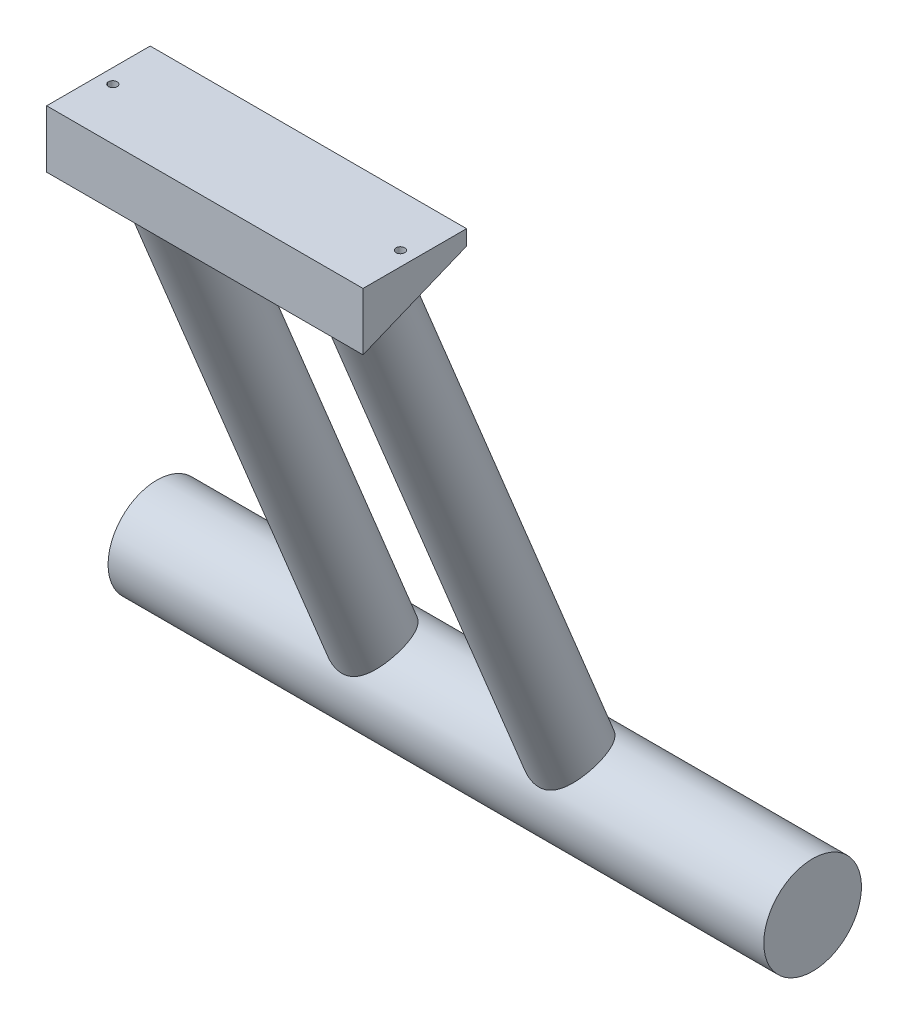
ISO-10303-21;
HEADER;
FILE_DESCRIPTION(('STEP AP214'),'2;1');
FILE_NAME('part.step','',(''),(''),'','','');
FILE_SCHEMA(('AUTOMOTIVE_DESIGN { 1 0 10303 214 1 1 1 1 }'));
ENDSEC;
DATA;
#1=APPLICATION_CONTEXT('core data for automotive mechanical design processes');
#2=APPLICATION_PROTOCOL_DEFINITION('international standard','automotive_design',2000,#1);
#3=PRODUCT_CONTEXT('',#1,'mechanical');
#4=PRODUCT('Part','Part','',(#3));
#5=PRODUCT_RELATED_PRODUCT_CATEGORY('part','',(#4));
#6=PRODUCT_DEFINITION_FORMATION('','',#4);
#7=PRODUCT_DEFINITION_CONTEXT('part definition',#1,'design');
#8=PRODUCT_DEFINITION('design','',#6,#7);
#9=PRODUCT_DEFINITION_SHAPE('','',#8);
#10=(LENGTH_UNIT() NAMED_UNIT(*) SI_UNIT(.MILLI.,.METRE.));
#11=(NAMED_UNIT(*) PLANE_ANGLE_UNIT() SI_UNIT($,.RADIAN.));
#12=(NAMED_UNIT(*) SI_UNIT($,.STERADIAN.) SOLID_ANGLE_UNIT());
#13=UNCERTAINTY_MEASURE_WITH_UNIT(LENGTH_MEASURE(1.E-05),#10,'distance_accuracy_value','');
#14=(GEOMETRIC_REPRESENTATION_CONTEXT(3) GLOBAL_UNCERTAINTY_ASSIGNED_CONTEXT((#13)) GLOBAL_UNIT_ASSIGNED_CONTEXT((#10,
#11,#12)) REPRESENTATION_CONTEXT('',''));
#15=CARTESIAN_POINT('',(0.,0.,0.));
#16=DIRECTION('',(0.,0.,1.));
#17=DIRECTION('',(1.,0.,0.));
#18=AXIS2_PLACEMENT_3D('',#15,#16,#17);
#19=CARTESIAN_POINT('',(-30.,-104.41240636067,-31.1617160473278));
#20=DIRECTION('',(1.,0.,0.));
#21=DIRECTION('',(0.,0.,-1.));
#22=AXIS2_PLACEMENT_3D('',#19,#20,#21);
#23=CYLINDRICAL_SURFACE('',#22,8.48528137423857);
#24=CARTESIAN_POINT('',(10.,-101.133046292842,-23.3357466156513));
#25=CARTESIAN_POINT('',(9.85651582124535,-101.133045580991,-23.3357467027047));
#26=CARTESIAN_POINT('',(9.71302770275493,-101.126305397713,-23.3385610233174));
#27=CARTESIAN_POINT('',(9.42750795174278,-101.099663635366,-23.3498059288629));
#28=CARTESIAN_POINT('',(9.28547643281759,-101.0797610376,-23.3582369484962));
#29=CARTESIAN_POINT('',(9.00390276717712,-101.027630434132,-23.3807076109788));
#30=CARTESIAN_POINT('',(8.86436546300603,-100.995380710101,-23.3947571386127));
#31=CARTESIAN_POINT('',(8.58897717115418,-100.919820898675,-23.4284403034134));
#32=CARTESIAN_POINT('',(8.45312831558882,-100.876504558696,-23.4480770980739));
#33=CARTESIAN_POINT('',(8.05548829626925,-100.733288675755,-23.5148158735549));
#34=CARTESIAN_POINT('',(7.80000970433354,-100.619391084458,-23.5700319089124));
#35=CARTESIAN_POINT('',(7.30922078482065,-100.365021722762,-23.7025487419277));
#36=CARTESIAN_POINT('',(7.07391088747445,-100.224549385687,-23.779850010547));
#37=CARTESIAN_POINT('',(6.71651048719022,-99.9871889286596,-23.9209981928665));
#38=CARTESIAN_POINT('',(6.5875448792888,-99.8960350272775,-23.9773737802516));
#39=CARTESIAN_POINT('',(6.33709399144576,-99.7090458882783,-24.098372697552));
#40=CARTESIAN_POINT('',(6.21560993927263,-99.6132098869034,-24.1629973758744));
#41=CARTESIAN_POINT('',(5.86245391055772,-99.3204856358605,-24.3698608590666));
#42=CARTESIAN_POINT('',(5.64222389377591,-99.1184806821583,-24.5250323804633));
#43=CARTESIAN_POINT('',(5.32034894439236,-98.7955463948892,-24.799676149462));
#44=CARTESIAN_POINT('',(5.2073361926874,-98.6756473675163,-24.907361437254));
#45=CARTESIAN_POINT('',(4.99402654135455,-98.4364722592174,-25.1354835193805));
#46=CARTESIAN_POINT('',(4.89373205313521,-98.3171963005247,-25.2559227239634));
#47=CARTESIAN_POINT('',(4.70725882021036,-98.0814832093835,-25.5093428446139));
#48=CARTESIAN_POINT('',(4.62105678300905,-97.965041668936,-25.6423024811492));
#49=CARTESIAN_POINT('',(4.46389946984491,-97.7368251896741,-25.920632788394));
#50=CARTESIAN_POINT('',(4.39293736785782,-97.62504817975,-26.0659978617212));
#51=CARTESIAN_POINT('',(4.28475507901011,-97.4379133688923,-26.3269746314893));
#52=CARTESIAN_POINT('',(4.24361589432514,-97.3609623613344,-26.4398376165535));
#53=CARTESIAN_POINT('',(4.17055506357579,-97.2113828217232,-26.6712566056315));
#54=CARTESIAN_POINT('',(4.13863143623936,-97.1387533632406,-26.7898113795536));
#55=CARTESIAN_POINT('',(4.08443157032255,-96.9986024644645,-27.0319379397813));
#56=CARTESIAN_POINT('',(4.06214925220769,-96.9310778274533,-27.1555065105975));
#57=CARTESIAN_POINT('',(4.02751647951389,-96.8017628053209,-27.406973420966));
#58=CARTESIAN_POINT('',(4.01516636489746,-96.7399726165443,-27.5348719085681));
#59=CARTESIAN_POINT('',(4.00056937925922,-96.6225890598988,-27.7943631123531));
#60=CARTESIAN_POINT('',(3.99834319005278,-96.5670086032678,-27.9259628386865));
#61=CARTESIAN_POINT('',(4.00408432771808,-96.4626376042911,-28.1916079296174));
#62=CARTESIAN_POINT('',(4.01205161612534,-96.4138470363249,-28.3256532849844));
#63=CARTESIAN_POINT('',(4.03805919877715,-96.323343267159,-28.5951493620164));
#64=CARTESIAN_POINT('',(4.05609985354018,-96.2816303193319,-28.7306001338098));
#65=CARTESIAN_POINT('',(4.10199879119041,-96.2053909863721,-29.0019092142404));
#66=CARTESIAN_POINT('',(4.12986085031717,-96.1708673736061,-29.1377676596751));
#67=CARTESIAN_POINT('',(4.19421285147819,-96.109757066109,-29.405473135608));
#68=CARTESIAN_POINT('',(4.23047094343276,-96.0829943079028,-29.5373358878741));
#69=CARTESIAN_POINT('',(4.31153351330985,-96.0361014225465,-29.7996233974382));
#70=CARTESIAN_POINT('',(4.35634098457944,-96.0159736252113,-29.9300476341075));
#71=CARTESIAN_POINT('',(4.50287246620755,-95.9651696762422,-30.3179025073848));
#72=CARTESIAN_POINT('',(4.61675402501663,-95.9440288764657,-30.5721138665648));
#73=CARTESIAN_POINT('',(4.88728672267728,-95.9229280360927,-31.0941083526591));
#74=CARTESIAN_POINT('',(5.04729808233927,-95.9256032670522,-31.3602263096916));
#75=CARTESIAN_POINT('',(5.39816546283054,-95.9529109121292,-31.8703803474564));
#76=CARTESIAN_POINT('',(5.58905376248151,-95.977566427512,-32.1143928981059));
#77=CARTESIAN_POINT('',(5.91448080918346,-96.0292199688916,-32.4812570759069));
#78=CARTESIAN_POINT('',(6.04015216997556,-96.0511394866006,-32.6128587135488));
#79=CARTESIAN_POINT('',(6.30071374327778,-96.09902455851,-32.8659008630277));
#80=CARTESIAN_POINT('',(6.43560579832192,-96.1249909227099,-32.9873393331526));
#81=CARTESIAN_POINT('',(6.7142658028323,-96.1794333480741,-33.2189738365197));
#82=CARTESIAN_POINT('',(6.85803359133048,-96.207909363728,-33.329170073552));
#83=CARTESIAN_POINT('',(7.15410406336504,-96.2656561500466,-33.5370271213299));
#84=CARTESIAN_POINT('',(7.30640432462376,-96.2949266939492,-33.6346914640992));
#85=CARTESIAN_POINT('',(7.70435474513431,-96.367999470187,-33.8652304683756));
#86=CARTESIAN_POINT('',(7.95590482493484,-96.4110899417651,-33.9885428096025));
#87=CARTESIAN_POINT('',(8.34603059358206,-96.4679525381664,-34.1431062479567));
#88=CARTESIAN_POINT('',(8.47815979968357,-96.4856066291012,-34.1895494649991));
#89=CARTESIAN_POINT('',(8.74618404523316,-96.5173579020548,-34.271400031629));
#90=CARTESIAN_POINT('',(8.88207692621495,-96.5314570777839,-34.3068135696474));
#91=CARTESIAN_POINT('',(9.15839073867328,-96.555356177415,-34.3660573296062));
#92=CARTESIAN_POINT('',(9.29884565926504,-96.5651051604282,-34.3897506390501));
#93=CARTESIAN_POINT('',(9.58160789123697,-96.5793729170904,-34.4242211463994));
#94=CARTESIAN_POINT('',(9.72391512307451,-96.583891914583,-34.4349988970917));
#95=CARTESIAN_POINT('',(10.0089235568049,-96.5873569735533,-34.4432741047753));
#96=CARTESIAN_POINT('',(10.1516245594545,-96.5863054684892,-34.4407773606903));
#97=CARTESIAN_POINT('',(10.4360252690646,-96.5787152660585,-34.4226023614498));
#98=CARTESIAN_POINT('',(10.5777250269669,-96.5721768499147,-34.4069247818566));
#99=CARTESIAN_POINT('',(10.8378621275634,-96.5554488760878,-34.3661845679029));
#100=CARTESIAN_POINT('',(10.9566225232294,-96.5459476616289,-34.3428662653642));
#101=CARTESIAN_POINT('',(11.1918142937156,-96.5238068393515,-34.2875572260615));
#102=CARTESIAN_POINT('',(11.3082449965981,-96.5111663397966,-34.2555640248931));
#103=CARTESIAN_POINT('',(11.6533930673313,-96.4693695519387,-34.147374413822));
#104=CARTESIAN_POINT('',(11.8779172315561,-96.4363415492496,-34.0589760653157));
#105=CARTESIAN_POINT('',(12.25589663148,-96.3743985402093,-33.881420599833));
#106=CARTESIAN_POINT('',(12.4125879088471,-96.3466650990471,-33.7985017246228));
#107=CARTESIAN_POINT('',(12.718009358458,-96.2902763004645,-33.6193216063488));
#108=CARTESIAN_POINT('',(12.8667386658721,-96.2616208434338,-33.523058917939));
#109=CARTESIAN_POINT('',(13.1561693871427,-96.2051052618171,-33.3184482421288));
#110=CARTESIAN_POINT('',(13.2968557987335,-96.177246669037,-33.2100787169049));
#111=CARTESIAN_POINT('',(13.5696829272309,-96.1239723414585,-32.9825717589181));
#112=CARTESIAN_POINT('',(13.7018246478427,-96.0985563195715,-32.8634355948183));
#113=CARTESIAN_POINT('',(13.9599335308049,-96.0511255149651,-32.6127756198126));
#114=CARTESIAN_POINT('',(14.0857172101973,-96.029191664243,-32.4810470439922));
#115=CARTESIAN_POINT('',(14.3276611950764,-95.9907827439656,-32.208269515735));
#116=CARTESIAN_POINT('',(14.4438181078376,-95.9743095928203,-32.0672173086218));
#117=CARTESIAN_POINT('',(14.7765957454392,-95.9351650052848,-31.6317968702305));
#118=CARTESIAN_POINT('',(14.9781513691908,-95.922640872163,-31.324552036046));
#119=CARTESIAN_POINT('',(15.3060388354398,-95.9336078708808,-30.7337100821721));
#120=CARTESIAN_POINT('',(15.4391862602853,-95.9518218824353,-30.4538194296034));
#121=CARTESIAN_POINT('',(15.6094411407417,-96.0023484698289,-30.0251783059848));
#122=CARTESIAN_POINT('',(15.6612921684889,-96.0230673626264,-29.8807885220031));
#123=CARTESIAN_POINT('',(15.754536152266,-96.0726439694061,-29.5900716212307));
#124=CARTESIAN_POINT('',(15.7959336726096,-96.1014981196034,-29.4437453794286));
#125=CARTESIAN_POINT('',(15.8679172940628,-96.1678168038701,-29.1493390576738));
#126=CARTESIAN_POINT('',(15.8984326329868,-96.2053351705739,-29.0012537453686));
#127=CARTESIAN_POINT('',(15.9477899572,-96.28893371522,-28.7055412577144));
#128=CARTESIAN_POINT('',(15.966631892799,-96.3350139296065,-28.5579140843182));
#129=CARTESIAN_POINT('',(15.9923078245139,-96.4355423798711,-28.2645316368076));
#130=CARTESIAN_POINT('',(15.9991461786089,-96.4899875709789,-28.1187757024141));
#131=CARTESIAN_POINT('',(16.0007033390074,-96.6068465290246,-27.8304357741845));
#132=CARTESIAN_POINT('',(15.9954231491118,-96.6692596355613,-27.6878515186204));
#133=CARTESIAN_POINT('',(15.9740010146666,-96.7946545674664,-27.4214939120583));
#134=CARTESIAN_POINT('',(15.9590260341904,-96.8569244296067,-27.2972888667559));
#135=CARTESIAN_POINT('',(15.9196011637783,-96.9868216224948,-27.0532114299648));
#136=CARTESIAN_POINT('',(15.8951481235533,-97.0544507285799,-26.9333404935322));
#137=CARTESIAN_POINT('',(15.8370974302134,-97.1943709560815,-26.698688647247));
#138=CARTESIAN_POINT('',(15.8035022306907,-97.2666608226665,-26.5839063812844));
#139=CARTESIAN_POINT('',(15.7275787933513,-97.4152087363199,-26.359911716281));
#140=CARTESIAN_POINT('',(15.6852471748651,-97.4914683109499,-26.2507014938788));
#141=CARTESIAN_POINT('',(15.5431332909731,-97.7295956693978,-25.9259474235893));
#142=CARTESIAN_POINT('',(15.4299103429155,-97.8967747225039,-25.7199838740634));
#143=CARTESIAN_POINT('',(15.1727093290181,-98.2382499009134,-25.3353836965832));
#144=CARTESIAN_POINT('',(15.0287255476091,-98.4125473439865,-25.1567521577003));
#145=CARTESIAN_POINT('',(14.6892176899875,-98.7894672992791,-24.800923140052));
#146=CARTESIAN_POINT('',(14.4891613624692,-98.9922824784465,-24.6282621218377));
#147=CARTESIAN_POINT('',(14.0567313983481,-99.3906814052616,-24.3172854998388));
#148=CARTESIAN_POINT('',(13.8242938001501,-99.5862498463213,-24.1790394189385));
#149=CARTESIAN_POINT('',(13.4332027703127,-99.8816150745244,-23.9861414633671));
#150=CARTESIAN_POINT('',(13.2842034174368,-99.9873393462846,-23.9206712636479));
#151=CARTESIAN_POINT('',(12.9763777602648,-100.190435612043,-23.8004069821794));
#152=CARTESIAN_POINT('',(12.8175488090174,-100.287805339306,-23.7456157927403));
#153=CARTESIAN_POINT('',(12.4908036174914,-100.471185552924,-23.6465565345737));
#154=CARTESIAN_POINT('',(12.3229083662261,-100.557220813135,-23.602265340479));
#155=CARTESIAN_POINT('',(11.9781573814665,-100.715008944797,-23.5238482215679));
#156=CARTESIAN_POINT('',(11.8013019341698,-100.786762272068,-23.4897219723121));
#157=CARTESIAN_POINT('',(11.4912341374334,-100.894540280225,-23.4398591368461));
#158=CARTESIAN_POINT('',(11.3599249812656,-100.934921587183,-23.4216529678334));
#159=CARTESIAN_POINT('',(11.0940144508113,-101.005266051281,-23.3904304596693));
#160=CARTESIAN_POINT('',(10.9594156552894,-101.035237105366,-23.3774101855293));
#161=CARTESIAN_POINT('',(10.6879984503869,-101.083643852957,-23.3565870517661));
#162=CARTESIAN_POINT('',(10.5511845295458,-101.102100454181,-23.3487747338582));
#163=CARTESIAN_POINT('',(10.2762483076347,-101.126802144235,-23.3383544195715));
#164=CARTESIAN_POINT('',(10.1381259793088,-101.133046978111,-23.3357465318488));
#165=CARTESIAN_POINT('',(10.,-101.133046292842,-23.3357466156513));
#166=B_SPLINE_CURVE_WITH_KNOTS('',3,(#24,#25,#26,#27,#28,#29,#30,#31,#32,#33,#34,#35,#36,#37,
#38,#39,#40,#41,#42,#43,#44,#45,#46,#47,#48,#49,#50,#51,#52,#53,#54,#55,#56,#57,#58,#59,#60,#61,
#62,#63,#64,#65,#66,#67,#68,#69,#70,#71,#72,#73,#74,#75,#76,#77,#78,#79,#80,#81,#82,#83,#84,#85,
#86,#87,#88,#89,#90,#91,#92,#93,#94,#95,#96,#97,#98,#99,#100,#101,#102,#103,#104,#105,#106,#107,
#108,#109,#110,#111,#112,#113,#114,#115,#116,#117,#118,#119,#120,#121,#122,#123,#124,#125,#126,
#127,#128,#129,#130,#131,#132,#133,#134,#135,#136,#137,#138,#139,#140,#141,#142,#143,#144,#145,
#146,#147,#148,#149,#150,#151,#152,#153,#154,#155,#156,#157,#158,#159,#160,#161,#162,#163,#164,
#165),.UNSPECIFIED.,.T.,.F.,(4,2,2,2,2,2,2,2,2,2,2,2,2,2,2,2,2,2,2,2,2,2,2,2,2,2,2,2,2,2,2,2,2,
2,2,2,2,2,2,2,2,2,2,2,2,2,2,2,2,2,2,2,2,2,2,2,2,2,2,2,2,2,2,2,2,2,2,2,2,2,4),(0.,
0.430277379209857,0.860588063319445,1.29165915820124,1.72297434681744,2.57471319644312,
3.42647021052093,3.92912169812249,4.43185545526146,5.43787456634901,6.02771983103026,
6.61767676488507,7.20664851709024,7.79535591389474,8.22290258188238,8.65035726213868,
9.07754200746142,9.50474137397227,9.93281306033788,10.3608831314052,10.788968523772,
11.217218690887,11.6348165025368,12.0525607946009,12.8874287422307,13.8157321949293,
14.7450124456966,15.2943813168402,15.8438602888829,16.3933292986396,16.9426431027713,
17.7893429762573,18.2124110554749,18.6352413341446,19.0629007618119,19.4905418849658,
19.9179962097147,20.3454286273239,20.7092374585502,21.0731497507139,21.8011226660049,
22.3388089773498,22.8765535741992,23.4152705173922,23.953924064623,24.5036836733828,
25.0536362151893,26.1509107987708,27.0782564774573,27.5421905782717,28.0059217599679,
28.4726156469633,28.9393115205224,29.4058379220165,29.8723256816887,30.2910703434371,
30.7099543057964,31.1287259578733,31.5476599638834,32.4092723789286,33.2710450267926,
34.2667342085498,35.2644187873615,35.8460378659841,36.4278142524687,37.0082971670671,
37.5887615521259,38.0040336121219,38.4189899660896,38.8331906405081,39.2473999623555),.UNSPECIFIED.);
#167=CARTESIAN_POINT('',(10.,-101.133046292842,-23.3357466156513));
#168=VERTEX_POINT('',#167);
#169=EDGE_CURVE('E121',#168,#168,#166,.T.);
#170=ORIENTED_EDGE('',*,*,#169,.T.);
#171=EDGE_LOOP('',(#170));
#172=FACE_BOUND('',#171,.T.);
#173=CARTESIAN_POINT('',(44.2317100383298,-101.133046292842,-23.3357466156513));
#174=CARTESIAN_POINT('',(44.0882258595751,-101.133045580991,-23.3357467027047));
#175=CARTESIAN_POINT('',(43.9447377410847,-101.126305397713,-23.3385610233174));
#176=CARTESIAN_POINT('',(43.6592179900725,-101.099663635366,-23.3498059288629));
#177=CARTESIAN_POINT('',(43.5171864711474,-101.0797610376,-23.3582369484962));
#178=CARTESIAN_POINT('',(43.2356128055069,-101.027630434132,-23.3807076109788));
#179=CARTESIAN_POINT('',(43.0960755013358,-100.995380710101,-23.3947571386127));
#180=CARTESIAN_POINT('',(42.8206872094839,-100.919820898675,-23.4284403034134));
#181=CARTESIAN_POINT('',(42.6848383539186,-100.876504558696,-23.4480770980739));
#182=CARTESIAN_POINT('',(42.287198334599,-100.733288675755,-23.5148158735549));
#183=CARTESIAN_POINT('',(42.0317197426633,-100.619391084458,-23.5700319089124));
#184=CARTESIAN_POINT('',(41.5409308231504,-100.365021722762,-23.7025487419277));
#185=CARTESIAN_POINT('',(41.3056209258042,-100.224549385687,-23.779850010547));
#186=CARTESIAN_POINT('',(40.94822052552,-99.9871889286596,-23.9209981928665));
#187=CARTESIAN_POINT('',(40.8192549176186,-99.8960350272775,-23.9773737802516));
#188=CARTESIAN_POINT('',(40.5688040297755,-99.7090458882783,-24.098372697552));
#189=CARTESIAN_POINT('',(40.4473199776024,-99.6132098869034,-24.1629973758744));
#190=CARTESIAN_POINT('',(40.0941639488875,-99.3204856358605,-24.3698608590666));
#191=CARTESIAN_POINT('',(39.8739339321057,-99.1184806821583,-24.5250323804633));
#192=CARTESIAN_POINT('',(39.5520589827221,-98.7955463948892,-24.799676149462));
#193=CARTESIAN_POINT('',(39.4390462310172,-98.6756473675163,-24.907361437254));
#194=CARTESIAN_POINT('',(39.2257365796843,-98.4364722592174,-25.1354835193805));
#195=CARTESIAN_POINT('',(39.125442091465,-98.3171963005246,-25.2559227239634));
#196=CARTESIAN_POINT('',(38.9389688585401,-98.0814832093835,-25.509342844614));
#197=CARTESIAN_POINT('',(38.8527668213388,-97.965041668936,-25.6423024811492));
#198=CARTESIAN_POINT('',(38.6956095081747,-97.7368251896741,-25.920632788394));
#199=CARTESIAN_POINT('',(38.6246474061876,-97.62504817975,-26.0659978617212));
#200=CARTESIAN_POINT('',(38.5164651173399,-97.4379133688923,-26.3269746314893));
#201=CARTESIAN_POINT('',(38.4753259326549,-97.3609623613344,-26.4398376165535));
#202=CARTESIAN_POINT('',(38.4022651019056,-97.2113828217232,-26.6712566056315));
#203=CARTESIAN_POINT('',(38.3703414745691,-97.1387533632406,-26.7898113795536));
#204=CARTESIAN_POINT('',(38.3161416086523,-96.9986024644645,-27.0319379397813));
#205=CARTESIAN_POINT('',(38.2938592905375,-96.9310778274533,-27.1555065105975));
#206=CARTESIAN_POINT('',(38.2592265178437,-96.8017628053209,-27.406973420966));
#207=CARTESIAN_POINT('',(38.2468764032272,-96.7399726165443,-27.5348719085681));
#208=CARTESIAN_POINT('',(38.232279417589,-96.6225890598988,-27.7943631123531));
#209=CARTESIAN_POINT('',(38.2300532283826,-96.5670086032678,-27.9259628386865));
#210=CARTESIAN_POINT('',(38.2357943660479,-96.4626376042911,-28.1916079296174));
#211=CARTESIAN_POINT('',(38.2437616544551,-96.4138470363249,-28.3256532849844));
#212=CARTESIAN_POINT('',(38.2697692371069,-96.323343267159,-28.5951493620164));
#213=CARTESIAN_POINT('',(38.28780989187,-96.2816303193319,-28.7306001338098));
#214=CARTESIAN_POINT('',(38.3337088295202,-96.2053909863721,-29.0019092142404));
#215=CARTESIAN_POINT('',(38.3615708886469,-96.1708673736061,-29.1377676596751));
#216=CARTESIAN_POINT('',(38.425922889808,-96.109757066109,-29.405473135608));
#217=CARTESIAN_POINT('',(38.4621809817625,-96.0829943079028,-29.5373358878741));
#218=CARTESIAN_POINT('',(38.5432435516396,-96.0361014225465,-29.7996233974381));
#219=CARTESIAN_POINT('',(38.5880510229092,-96.0159736252113,-29.9300476341075));
#220=CARTESIAN_POINT('',(38.7345825045373,-95.9651696762422,-30.3179025073848));
#221=CARTESIAN_POINT('',(38.8484640633464,-95.9440288764657,-30.5721138665648));
#222=CARTESIAN_POINT('',(39.1189967610071,-95.9229280360927,-31.0941083526591));
#223=CARTESIAN_POINT('',(39.279008120669,-95.9256032670522,-31.3602263096916));
#224=CARTESIAN_POINT('',(39.6298755011603,-95.9529109121292,-31.8703803474564));
#225=CARTESIAN_POINT('',(39.8207638008113,-95.977566427512,-32.1143928981059));
#226=CARTESIAN_POINT('',(40.1461908475132,-96.0292199688916,-32.4812570759069));
#227=CARTESIAN_POINT('',(40.2718622083053,-96.0511394866006,-32.6128587135488));
#228=CARTESIAN_POINT('',(40.5324237816076,-96.09902455851,-32.8659008630277));
#229=CARTESIAN_POINT('',(40.6673158366517,-96.1249909227099,-32.9873393331526));
#230=CARTESIAN_POINT('',(40.9459758411621,-96.1794333480741,-33.2189738365197));
#231=CARTESIAN_POINT('',(41.0897436296603,-96.207909363728,-33.329170073552));
#232=CARTESIAN_POINT('',(41.3858141016948,-96.2656561500466,-33.5370271213299));
#233=CARTESIAN_POINT('',(41.5381143629535,-96.2949266939492,-33.6346914640992));
#234=CARTESIAN_POINT('',(41.9360647834641,-96.367999470187,-33.8652304683755));
#235=CARTESIAN_POINT('',(42.1876148632646,-96.4110899417651,-33.9885428096024));
#236=CARTESIAN_POINT('',(42.5777406319118,-96.4679525381664,-34.1431062479567));
#237=CARTESIAN_POINT('',(42.7098698380133,-96.4856066291012,-34.1895494649991));
#238=CARTESIAN_POINT('',(42.9778940835629,-96.5173579020548,-34.271400031629));
#239=CARTESIAN_POINT('',(43.1137869645447,-96.5314570777839,-34.3068135696474));
#240=CARTESIAN_POINT('',(43.3901007770031,-96.555356177415,-34.3660573296062));
#241=CARTESIAN_POINT('',(43.5305556975948,-96.5651051604282,-34.3897506390501));
#242=CARTESIAN_POINT('',(43.8133179295668,-96.5793729170904,-34.4242211463994));
#243=CARTESIAN_POINT('',(43.9556251614043,-96.583891914583,-34.4349988970917));
#244=CARTESIAN_POINT('',(44.2406335951347,-96.5873569735533,-34.4432741047753));
#245=CARTESIAN_POINT('',(44.3833345977843,-96.5863054684892,-34.4407773606903));
#246=CARTESIAN_POINT('',(44.6677353073944,-96.5787152660585,-34.4226023614498));
#247=CARTESIAN_POINT('',(44.8094350652967,-96.5721768499147,-34.4069247818566));
#248=CARTESIAN_POINT('',(45.0695721658932,-96.5554488760878,-34.3661845679029));
#249=CARTESIAN_POINT('',(45.1883325615592,-96.5459476616289,-34.3428662653642));
#250=CARTESIAN_POINT('',(45.4235243320454,-96.5238068393515,-34.2875572260615));
#251=CARTESIAN_POINT('',(45.5399550349279,-96.5111663397966,-34.255564024893));
#252=CARTESIAN_POINT('',(45.8851031056611,-96.4693695519387,-34.147374413822));
#253=CARTESIAN_POINT('',(46.1096272698859,-96.4363415492496,-34.0589760653157));
#254=CARTESIAN_POINT('',(46.4876066698098,-96.3743985402093,-33.8814205998329));
#255=CARTESIAN_POINT('',(46.6442979471769,-96.3466650990471,-33.7985017246228));
#256=CARTESIAN_POINT('',(46.9497193967878,-96.2902763004645,-33.6193216063488));
#257=CARTESIAN_POINT('',(47.0984487042019,-96.2616208434338,-33.523058917939));
#258=CARTESIAN_POINT('',(47.3878794254725,-96.2051052618171,-33.3184482421287));
#259=CARTESIAN_POINT('',(47.5285658370632,-96.177246669037,-33.2100787169049));
#260=CARTESIAN_POINT('',(47.8013929655607,-96.1239723414585,-32.9825717589181));
#261=CARTESIAN_POINT('',(47.9335346861725,-96.0985563195715,-32.8634355948183));
#262=CARTESIAN_POINT('',(48.1916435691347,-96.0511255149651,-32.6127756198125));
#263=CARTESIAN_POINT('',(48.3174272485271,-96.029191664243,-32.4810470439921));
#264=CARTESIAN_POINT('',(48.5593712334062,-95.9907827439655,-32.2082695157349));
#265=CARTESIAN_POINT('',(48.6755281461674,-95.9743095928203,-32.0672173086218));
#266=CARTESIAN_POINT('',(49.008305783769,-95.9351650052848,-31.6317968702304));
#267=CARTESIAN_POINT('',(49.2098614075206,-95.922640872163,-31.3245520360459));
#268=CARTESIAN_POINT('',(49.5377488737696,-95.9336078708808,-30.7337100821721));
#269=CARTESIAN_POINT('',(49.670896298615,-95.9518218824353,-30.4538194296033));
#270=CARTESIAN_POINT('',(49.8411511790715,-96.0023484698289,-30.0251783059848));
#271=CARTESIAN_POINT('',(49.8930022068186,-96.0230673626264,-29.8807885220031));
#272=CARTESIAN_POINT('',(49.9862461905958,-96.0726439694061,-29.5900716212307));
#273=CARTESIAN_POINT('',(50.0276437109394,-96.1014981196034,-29.4437453794286));
#274=CARTESIAN_POINT('',(50.0996273323926,-96.1678168038701,-29.1493390576737));
#275=CARTESIAN_POINT('',(50.1301426713166,-96.2053351705739,-29.0012537453685));
#276=CARTESIAN_POINT('',(50.1794999955298,-96.28893371522,-28.7055412577143));
#277=CARTESIAN_POINT('',(50.1983419311287,-96.3350139296065,-28.5579140843181));
#278=CARTESIAN_POINT('',(50.2240178628437,-96.4355423798711,-28.2645316368075));
#279=CARTESIAN_POINT('',(50.2308562169386,-96.4899875709789,-28.118775702414));
#280=CARTESIAN_POINT('',(50.2324133773372,-96.6068465290246,-27.8304357741845));
#281=CARTESIAN_POINT('',(50.2271331874415,-96.6692596355613,-27.6878515186204));
#282=CARTESIAN_POINT('',(50.2057110529964,-96.7946545674664,-27.4214939120583));
#283=CARTESIAN_POINT('',(50.1907360725202,-96.8569244296067,-27.2972888667559));
#284=CARTESIAN_POINT('',(50.151311202108,-96.9868216224948,-27.0532114299648));
#285=CARTESIAN_POINT('',(50.126858161883,-97.05445072858,-26.9333404935322));
#286=CARTESIAN_POINT('',(50.0688074685432,-97.1943709560815,-26.698688647247));
#287=CARTESIAN_POINT('',(50.0352122690205,-97.2666608226665,-26.5839063812844));
#288=CARTESIAN_POINT('',(49.9592888316811,-97.4152087363199,-26.3599117162809));
#289=CARTESIAN_POINT('',(49.9169572131949,-97.4914683109499,-26.2507014938787));
#290=CARTESIAN_POINT('',(49.7748433293029,-97.7295956693978,-25.9259474235893));
#291=CARTESIAN_POINT('',(49.6616203812453,-97.8967747225039,-25.7199838740634));
#292=CARTESIAN_POINT('',(49.4044193673478,-98.2382499009134,-25.3353836965832));
#293=CARTESIAN_POINT('',(49.2604355859388,-98.4125473439866,-25.1567521577003));
#294=CARTESIAN_POINT('',(48.9209277283173,-98.7894672992792,-24.8009231400519));
#295=CARTESIAN_POINT('',(48.7208714007989,-98.9922824784465,-24.6282621218377));
#296=CARTESIAN_POINT('',(48.2884414366779,-99.3906814052617,-24.3172854998388));
#297=CARTESIAN_POINT('',(48.0560038384798,-99.5862498463213,-24.1790394189385));
#298=CARTESIAN_POINT('',(47.6649128086425,-99.8816150745244,-23.9861414633671));
#299=CARTESIAN_POINT('',(47.5159134557665,-99.9873393462846,-23.9206712636479));
#300=CARTESIAN_POINT('',(47.2080877985945,-100.190435612043,-23.8004069821794));
#301=CARTESIAN_POINT('',(47.0492588473472,-100.287805339306,-23.7456157927403));
#302=CARTESIAN_POINT('',(46.7225136558212,-100.471185552924,-23.6465565345737));
#303=CARTESIAN_POINT('',(46.5546184045559,-100.557220813135,-23.602265340479));
#304=CARTESIAN_POINT('',(46.2098674197962,-100.715008944797,-23.5238482215679));
#305=CARTESIAN_POINT('',(46.0330119724995,-100.786762272068,-23.4897219723121));
#306=CARTESIAN_POINT('',(45.7229441757631,-100.894540280225,-23.4398591368461));
#307=CARTESIAN_POINT('',(45.5916350195954,-100.934921587183,-23.4216529678333));
#308=CARTESIAN_POINT('',(45.3257244891411,-101.005266051281,-23.3904304596693));
#309=CARTESIAN_POINT('',(45.1911256936191,-101.035237105366,-23.3774101855293));
#310=CARTESIAN_POINT('',(44.9197084887166,-101.083643852957,-23.3565870517661));
#311=CARTESIAN_POINT('',(44.7828945678756,-101.102100454181,-23.3487747338582));
#312=CARTESIAN_POINT('',(44.5079583459645,-101.126802144235,-23.3383544195715));
#313=CARTESIAN_POINT('',(44.3698360176386,-101.133046978111,-23.3357465318488));
#314=CARTESIAN_POINT('',(44.2317100383298,-101.133046292842,-23.3357466156513));
#315=B_SPLINE_CURVE_WITH_KNOTS('',3,(#173,#174,#175,#176,#177,#178,#179,#180,#181,#182,#183,
#184,#185,#186,#187,#188,#189,#190,#191,#192,#193,#194,#195,#196,#197,#198,#199,#200,#201,#202,
#203,#204,#205,#206,#207,#208,#209,#210,#211,#212,#213,#214,#215,#216,#217,#218,#219,#220,#221,
#222,#223,#224,#225,#226,#227,#228,#229,#230,#231,#232,#233,#234,#235,#236,#237,#238,#239,#240,
#241,#242,#243,#244,#245,#246,#247,#248,#249,#250,#251,#252,#253,#254,#255,#256,#257,#258,#259,
#260,#261,#262,#263,#264,#265,#266,#267,#268,#269,#270,#271,#272,#273,#274,#275,#276,#277,#278,
#279,#280,#281,#282,#283,#284,#285,#286,#287,#288,#289,#290,#291,#292,#293,#294,#295,#296,#297,
#298,#299,#300,#301,#302,#303,#304,#305,#306,#307,#308,#309,#310,#311,#312,#313,#314),
.UNSPECIFIED.,.T.,.F.,(4,2,2,2,2,2,2,2,2,2,2,2,2,2,2,2,2,2,2,2,2,2,2,2,2,2,2,2,2,2,2,2,2,2,2,2,
2,2,2,2,2,2,2,2,2,2,2,2,2,2,2,2,2,2,2,2,2,2,2,2,2,2,2,2,2,2,2,2,2,2,4),(0.,0.430277379209858,
0.860588063319449,1.29165915820124,1.72297434681744,2.57471319644313,3.42647021052093,
3.92912169812249,4.43185545526145,5.437874566349,6.02771983103026,6.61767676488508,
7.20664851709024,7.79535591389473,8.22290258188237,8.65035726213867,9.0775420074614,
9.50474137397227,9.93281306033787,10.3608831314052,10.788968523772,11.217218690887,
11.6348165025368,12.0525607946009,12.8874287422307,13.8157321949293,14.7450124456966,
15.2943813168402,15.8438602888829,16.3933292986396,16.9426431027713,17.7893429762573,
18.2124110554749,18.6352413341446,19.0629007618118,19.4905418849658,19.9179962097147,
20.3454286273239,20.7092374585502,21.0731497507139,21.8011226660049,22.3388089773498,
22.8765535741992,23.4152705173922,23.953924064623,24.5036836733828,25.0536362151893,
26.1509107987708,27.0782564774573,27.5421905782717,28.0059217599679,28.4726156469633,
28.9393115205225,29.4058379220165,29.8723256816887,30.2910703434372,30.7099543057964,
31.1287259578733,31.5476599638834,32.4092723789286,33.2710450267926,34.2667342085498,
35.2644187873615,35.8460378659841,36.4278142524687,37.0082971670671,37.5887615521259,
38.0040336121219,38.4189899660896,38.833190640508,39.2473999623555),.UNSPECIFIED.);
#316=CARTESIAN_POINT('',(44.2317100383298,-101.133046292842,-23.3357466156513));
#317=VERTEX_POINT('',#316);
#318=EDGE_CURVE('E174',#317,#317,#315,.T.);
#319=ORIENTED_EDGE('',*,*,#318,.T.);
#320=EDGE_LOOP('',(#319));
#321=FACE_BOUND('',#320,.T.);
#322=CARTESIAN_POINT('',(-30.,-104.41240636067,-31.1617160473278));
#323=DIRECTION('',(-1.,0.,0.));
#324=DIRECTION('',(0.,0.,1.));
#325=AXIS2_PLACEMENT_3D('',#322,#323,#324);
#326=CIRCLE('',#325,8.48528137423857);
#327=CARTESIAN_POINT('',(-30.,-104.41240636067,-22.6764346730892));
#328=VERTEX_POINT('',#327);
#329=EDGE_CURVE('E181',#328,#328,#326,.T.);
#330=ORIENTED_EDGE('',*,*,#329,.F.);
#331=EDGE_LOOP('',(#330));
#332=FACE_BOUND('',#331,.T.);
#333=CARTESIAN_POINT('',(84.,-104.41240636067,-31.1617160473278));
#334=DIRECTION('',(-1.,0.,0.));
#335=DIRECTION('',(0.,0.,1.));
#336=AXIS2_PLACEMENT_3D('',#333,#334,#335);
#337=CIRCLE('',#336,8.48528137423857);
#338=CARTESIAN_POINT('',(84.,-104.41240636067,-22.6764346730892));
#339=VERTEX_POINT('',#338);
#340=EDGE_CURVE('E203',#339,#339,#337,.T.);
#341=ORIENTED_EDGE('',*,*,#340,.T.);
#342=EDGE_LOOP('',(#341));
#343=FACE_BOUND('',#342,.T.);
#344=ADVANCED_FACE('F39',(#172,#321,#332,#343),#23,.T.);
#345=CARTESIAN_POINT('',(-30.,-104.41240636067,-31.1617160473278));
#346=DIRECTION('',(-1.,0.,0.));
#347=DIRECTION('',(0.,0.,1.));
#348=AXIS2_PLACEMENT_3D('',#345,#346,#347);
#349=PLANE('',#348);
#350=ORIENTED_EDGE('',*,*,#329,.T.);
#351=EDGE_LOOP('',(#350));
#352=FACE_BOUND('',#351,.T.);
#353=ADVANCED_FACE('F159',(#352),#349,.T.);
#354=CARTESIAN_POINT('',(84.,-104.41240636067,-31.1617160473278));
#355=DIRECTION('',(-1.,0.,0.));
#356=DIRECTION('',(0.,0.,1.));
#357=AXIS2_PLACEMENT_3D('',#354,#355,#356);
#358=PLANE('',#357);
#359=ORIENTED_EDGE('',*,*,#340,.F.);
#360=EDGE_LOOP('',(#359));
#361=FACE_BOUND('',#360,.T.);
#362=ADVANCED_FACE('F165',(#361),#358,.F.);
#363=CARTESIAN_POINT('',(10.,-98.8597416109181,-28.8884113654035));
#364=DIRECTION('',(0.,0.925444124958712,0.378884113654035));
#365=DIRECTION('',(0.,-0.378884113654035,0.925444124958712));
#366=AXIS2_PLACEMENT_3D('',#363,#364,#365);
#367=CYLINDRICAL_SURFACE('',#366,6.);
#368=CARTESIAN_POINT('',(10.,-6.31532911504684,9.));
#369=DIRECTION('',(0.,0.925444124958712,0.378884113654035));
#370=DIRECTION('',(0.,-0.378884113654035,0.925444124958712));
#371=AXIS2_PLACEMENT_3D('',#368,#369,#370);
#372=CIRCLE('',#371,6.);
#373=CARTESIAN_POINT('',(10.,-8.58863379697105,14.5526647497523));
#374=VERTEX_POINT('',#373);
#375=EDGE_CURVE('E49',#374,#374,#372,.F.);
#376=ORIENTED_EDGE('',*,*,#375,.T.);
#377=EDGE_LOOP('',(#376));
#378=FACE_BOUND('',#377,.T.);
#379=ORIENTED_EDGE('',*,*,#169,.F.);
#380=EDGE_LOOP('',(#379));
#381=FACE_BOUND('',#380,.T.);
#382=ADVANCED_FACE('F186',(#378,#381),#367,.T.);
#383=CARTESIAN_POINT('',(44.2317100383298,-98.8597416109181,-28.8884113654035));
#384=DIRECTION('',(0.,0.925444124958712,0.378884113654035));
#385=DIRECTION('',(0.,-0.378884113654035,0.925444124958712));
#386=AXIS2_PLACEMENT_3D('',#383,#384,#385);
#387=CYLINDRICAL_SURFACE('',#386,6.);
#388=CARTESIAN_POINT('',(44.2317100383298,-6.31532911504684,9.));
#389=DIRECTION('',(0.,0.925444124958712,0.378884113654035));
#390=DIRECTION('',(0.,-0.378884113654035,0.925444124958712));
#391=AXIS2_PLACEMENT_3D('',#388,#389,#390);
#392=CIRCLE('',#391,6.);
#393=CARTESIAN_POINT('',(44.2317100383298,-8.58863379697105,14.5526647497523));
#394=VERTEX_POINT('',#393);
#395=EDGE_CURVE('E11',#394,#394,#392,.F.);
#396=ORIENTED_EDGE('',*,*,#395,.T.);
#397=EDGE_LOOP('',(#396));
#398=FACE_BOUND('',#397,.T.);
#399=ORIENTED_EDGE('',*,*,#318,.F.);
#400=EDGE_LOOP('',(#399));
#401=FACE_BOUND('',#400,.T.);
#402=ADVANCED_FACE('F183',(#398,#401),#387,.T.);
#403=CARTESIAN_POINT('',(0.,-10.,18.));
#404=DIRECTION('',(-1.,0.,0.));
#405=DIRECTION('',(0.,0.,1.));
#406=AXIS2_PLACEMENT_3D('',#403,#404,#405);
#407=PLANE('',#406);
#408=DIRECTION('',(0.,0.378884113654035,-0.925444124958712));
#409=VECTOR('',#408,1.);
#410=CARTESIAN_POINT('',(0.,-10.,18.));
#411=LINE('',#410,#409);
#412=CARTESIAN_POINT('',(0.,-10.,18.));
#413=VERTEX_POINT('',#412);
#414=CARTESIAN_POINT('',(0.,-2.63065823009368,0.));
#415=VERTEX_POINT('',#414);
#416=EDGE_CURVE('E114',#413,#415,#411,.T.);
#417=ORIENTED_EDGE('',*,*,#416,.F.);
#418=DIRECTION('',(0.,1.,0.));
#419=VECTOR('',#418,1.);
#420=CARTESIAN_POINT('',(0.,-10.,18.));
#421=LINE('',#420,#419);
#422=CARTESIAN_POINT('',(0.,0.,18.));
#423=VERTEX_POINT('',#422);
#424=EDGE_CURVE('E100',#413,#423,#421,.T.);
#425=ORIENTED_EDGE('',*,*,#424,.T.);
#426=DIRECTION('',(0.,0.,1.));
#427=VECTOR('',#426,1.);
#428=CARTESIAN_POINT('',(0.,0.,18.));
#429=LINE('',#428,#427);
#430=CARTESIAN_POINT('',(0.,0.,0.));
#431=VERTEX_POINT('',#430);
#432=EDGE_CURVE('E135',#431,#423,#429,.T.);
#433=ORIENTED_EDGE('',*,*,#432,.F.);
#434=DIRECTION('',(0.,1.,0.));
#435=VECTOR('',#434,1.);
#436=CARTESIAN_POINT('',(0.,-10.,0.));
#437=LINE('',#436,#435);
#438=EDGE_CURVE('E83',#415,#431,#437,.T.);
#439=ORIENTED_EDGE('',*,*,#438,.F.);
#440=EDGE_LOOP('',(#417,#425,#433,#439));
#441=FACE_BOUND('',#440,.T.);
#442=ADVANCED_FACE('F41',(#441),#407,.T.);
#443=CARTESIAN_POINT('',(0.,-10.,0.));
#444=DIRECTION('',(0.,0.,-1.));
#445=DIRECTION('',(-1.,0.,0.));
#446=AXIS2_PLACEMENT_3D('',#443,#444,#445);
#447=PLANE('',#446);
#448=DIRECTION('',(-1.,0.,0.));
#449=VECTOR('',#448,1.);
#450=CARTESIAN_POINT('',(55.,-2.63065823009368,0.));
#451=LINE('',#450,#449);
#452=CARTESIAN_POINT('',(55.,-2.63065823009368,0.));
#453=VERTEX_POINT('',#452);
#454=EDGE_CURVE('E132',#453,#415,#451,.T.);
#455=ORIENTED_EDGE('',*,*,#454,.T.);
#456=ORIENTED_EDGE('',*,*,#438,.T.);
#457=DIRECTION('',(-1.,0.,0.));
#458=VECTOR('',#457,1.);
#459=CARTESIAN_POINT('',(0.,0.,0.));
#460=LINE('',#459,#458);
#461=CARTESIAN_POINT('',(55.,0.,0.));
#462=VERTEX_POINT('',#461);
#463=EDGE_CURVE('E90',#462,#431,#460,.T.);
#464=ORIENTED_EDGE('',*,*,#463,.F.);
#465=DIRECTION('',(0.,1.,0.));
#466=VECTOR('',#465,1.);
#467=CARTESIAN_POINT('',(55.,-10.,0.));
#468=LINE('',#467,#466);
#469=EDGE_CURVE('E75',#453,#462,#468,.T.);
#470=ORIENTED_EDGE('',*,*,#469,.F.);
#471=EDGE_LOOP('',(#455,#456,#464,#470));
#472=FACE_BOUND('',#471,.T.);
#473=ADVANCED_FACE('F94',(#472),#447,.T.);
#474=CARTESIAN_POINT('',(55.,-10.,0.));
#475=DIRECTION('',(1.,0.,0.));
#476=DIRECTION('',(0.,0.,-1.));
#477=AXIS2_PLACEMENT_3D('',#474,#475,#476);
#478=PLANE('',#477);
#479=DIRECTION('',(0.,0.378884113654035,-0.925444124958712));
#480=VECTOR('',#479,1.);
#481=CARTESIAN_POINT('',(55.,-10.,18.));
#482=LINE('',#481,#480);
#483=CARTESIAN_POINT('',(55.,-10.,18.));
#484=VERTEX_POINT('',#483);
#485=EDGE_CURVE('E57',#484,#453,#482,.T.);
#486=ORIENTED_EDGE('',*,*,#485,.T.);
#487=ORIENTED_EDGE('',*,*,#469,.T.);
#488=DIRECTION('',(0.,0.,-1.));
#489=VECTOR('',#488,1.);
#490=CARTESIAN_POINT('',(55.,0.,0.));
#491=LINE('',#490,#489);
#492=CARTESIAN_POINT('',(55.,0.,18.));
#493=VERTEX_POINT('',#492);
#494=EDGE_CURVE('E78',#493,#462,#491,.T.);
#495=ORIENTED_EDGE('',*,*,#494,.F.);
#496=DIRECTION('',(0.,1.,0.));
#497=VECTOR('',#496,1.);
#498=CARTESIAN_POINT('',(55.,-10.,18.));
#499=LINE('',#498,#497);
#500=EDGE_CURVE('E84',#484,#493,#499,.T.);
#501=ORIENTED_EDGE('',*,*,#500,.F.);
#502=EDGE_LOOP('',(#486,#487,#495,#501));
#503=FACE_BOUND('',#502,.T.);
#504=ADVANCED_FACE('F77',(#503),#478,.T.);
#505=CARTESIAN_POINT('',(55.,-10.,18.));
#506=DIRECTION('',(0.,0.,1.));
#507=DIRECTION('',(1.,0.,0.));
#508=AXIS2_PLACEMENT_3D('',#505,#506,#507);
#509=PLANE('',#508);
#510=DIRECTION('',(1.,0.,0.));
#511=VECTOR('',#510,1.);
#512=CARTESIAN_POINT('',(55.,0.,18.));
#513=LINE('',#512,#511);
#514=EDGE_CURVE('E92',#423,#493,#513,.T.);
#515=ORIENTED_EDGE('',*,*,#514,.F.);
#516=ORIENTED_EDGE('',*,*,#424,.F.);
#517=DIRECTION('',(1.,0.,0.));
#518=VECTOR('',#517,1.);
#519=CARTESIAN_POINT('',(55.,-10.,18.));
#520=LINE('',#519,#518);
#521=EDGE_CURVE('E97',#413,#484,#520,.T.);
#522=ORIENTED_EDGE('',*,*,#521,.T.);
#523=ORIENTED_EDGE('',*,*,#500,.T.);
#524=EDGE_LOOP('',(#515,#516,#522,#523));
#525=FACE_BOUND('',#524,.T.);
#526=ADVANCED_FACE('F142',(#525),#509,.T.);
#527=CARTESIAN_POINT('',(0.,0.,0.));
#528=DIRECTION('',(0.,-1.,0.));
#529=DIRECTION('',(0.,0.,-1.));
#530=AXIS2_PLACEMENT_3D('',#527,#528,#529);
#531=PLANE('',#530);
#532=CARTESIAN_POINT('',(2.5,0.,9.00000000000001));
#533=DIRECTION('',(0.,1.,0.));
#534=DIRECTION('',(0.,0.,1.));
#535=AXIS2_PLACEMENT_3D('',#532,#533,#534);
#536=CIRCLE('',#535,0.75);
#537=CARTESIAN_POINT('',(2.5,0.,9.75000000000001));
#538=VERTEX_POINT('',#537);
#539=EDGE_CURVE('E110',#538,#538,#536,.T.);
#540=ORIENTED_EDGE('',*,*,#539,.F.);
#541=EDGE_LOOP('',(#540));
#542=FACE_BOUND('',#541,.T.);
#543=CARTESIAN_POINT('',(52.5,0.,9.00000000000001));
#544=DIRECTION('',(0.,1.,0.));
#545=DIRECTION('',(0.,0.,1.));
#546=AXIS2_PLACEMENT_3D('',#543,#544,#545);
#547=CIRCLE('',#546,0.749999999999999);
#548=CARTESIAN_POINT('',(52.5,0.,9.75000000000001));
#549=VERTEX_POINT('',#548);
#550=EDGE_CURVE('E116',#549,#549,#547,.T.);
#551=ORIENTED_EDGE('',*,*,#550,.F.);
#552=EDGE_LOOP('',(#551));
#553=FACE_BOUND('',#552,.T.);
#554=ORIENTED_EDGE('',*,*,#432,.T.);
#555=ORIENTED_EDGE('',*,*,#514,.T.);
#556=ORIENTED_EDGE('',*,*,#494,.T.);
#557=ORIENTED_EDGE('',*,*,#463,.T.);
#558=EDGE_LOOP('',(#554,#555,#556,#557));
#559=FACE_BOUND('',#558,.T.);
#560=ADVANCED_FACE('F89',(#542,#553,#559),#531,.F.);
#561=CARTESIAN_POINT('',(55.,-10.,18.));
#562=DIRECTION('',(0.,0.925444124958712,0.378884113654035));
#563=DIRECTION('',(0.,-0.378884113654035,0.925444124958712));
#564=AXIS2_PLACEMENT_3D('',#561,#562,#563);
#565=PLANE('',#564);
#566=CARTESIAN_POINT('',(2.5,-6.31532911504683,9.00000000000001));
#567=DIRECTION('',(0.,0.925444124958712,0.378884113654035));
#568=DIRECTION('',(0.,0.378884113654035,-0.925444124958712));
#569=AXIS2_PLACEMENT_3D('',#566,#567,#568);
#570=ELLIPSE('',#569,0.810421698915059,0.75);
#571=CARTESIAN_POINT('',(2.5,-6.0082732079674,8.25000000000001));
#572=VERTEX_POINT('',#571);
#573=EDGE_CURVE('E43',#572,#572,#570,.T.);
#574=ORIENTED_EDGE('',*,*,#573,.T.);
#575=EDGE_LOOP('',(#574));
#576=FACE_BOUND('',#575,.T.);
#577=CARTESIAN_POINT('',(52.5,-6.31532911504683,9.00000000000001));
#578=DIRECTION('',(0.,0.925444124958712,0.378884113654035));
#579=DIRECTION('',(0.,0.378884113654035,-0.925444124958712));
#580=AXIS2_PLACEMENT_3D('',#577,#578,#579);
#581=ELLIPSE('',#580,0.810421698915058,0.749999999999999);
#582=CARTESIAN_POINT('',(52.5,-6.0082732079674,8.25000000000001));
#583=VERTEX_POINT('',#582);
#584=EDGE_CURVE('E108',#583,#583,#581,.T.);
#585=ORIENTED_EDGE('',*,*,#584,.T.);
#586=EDGE_LOOP('',(#585));
#587=FACE_BOUND('',#586,.T.);
#588=ORIENTED_EDGE('',*,*,#395,.F.);
#589=EDGE_LOOP('',(#588));
#590=FACE_BOUND('',#589,.T.);
#591=ORIENTED_EDGE('',*,*,#375,.F.);
#592=EDGE_LOOP('',(#591));
#593=FACE_BOUND('',#592,.T.);
#594=ORIENTED_EDGE('',*,*,#416,.T.);
#595=ORIENTED_EDGE('',*,*,#454,.F.);
#596=ORIENTED_EDGE('',*,*,#485,.F.);
#597=ORIENTED_EDGE('',*,*,#521,.F.);
#598=EDGE_LOOP('',(#594,#595,#596,#597));
#599=FACE_BOUND('',#598,.T.);
#600=ADVANCED_FACE('F143',(#576,#587,#590,#593,#599),#565,.F.);
#601=CARTESIAN_POINT('',(52.5,-112.238375792347,9.00000000000001));
#602=DIRECTION('',(0.,1.,0.));
#603=DIRECTION('',(0.,0.,1.));
#604=AXIS2_PLACEMENT_3D('',#601,#602,#603);
#605=CYLINDRICAL_SURFACE('',#604,0.749999999999999);
#606=ORIENTED_EDGE('',*,*,#550,.T.);
#607=EDGE_LOOP('',(#606));
#608=FACE_BOUND('',#607,.T.);
#609=ORIENTED_EDGE('',*,*,#584,.F.);
#610=EDGE_LOOP('',(#609));
#611=FACE_BOUND('',#610,.T.);
#612=ADVANCED_FACE('F146',(#608,#611),#605,.F.);
#613=CARTESIAN_POINT('',(2.5,-112.238375792347,9.00000000000001));
#614=DIRECTION('',(0.,1.,0.));
#615=DIRECTION('',(0.,0.,1.));
#616=AXIS2_PLACEMENT_3D('',#613,#614,#615);
#617=CYLINDRICAL_SURFACE('',#616,0.75);
#618=ORIENTED_EDGE('',*,*,#539,.T.);
#619=EDGE_LOOP('',(#618));
#620=FACE_BOUND('',#619,.T.);
#621=ORIENTED_EDGE('',*,*,#573,.F.);
#622=EDGE_LOOP('',(#621));
#623=FACE_BOUND('',#622,.T.);
#624=ADVANCED_FACE('F153',(#620,#623),#617,.F.);
#625=CLOSED_SHELL('',(#344,#353,#362,#382,#402,#442,#473,#504,#526,#560,#600,#612,#624));
#626=MANIFOLD_SOLID_BREP('B2',#625);
#627=ADVANCED_BREP_SHAPE_REPRESENTATION('',(#18,#626),#14);
#628=SHAPE_DEFINITION_REPRESENTATION(#9,#627);
ENDSEC;
END-ISO-10303-21;
